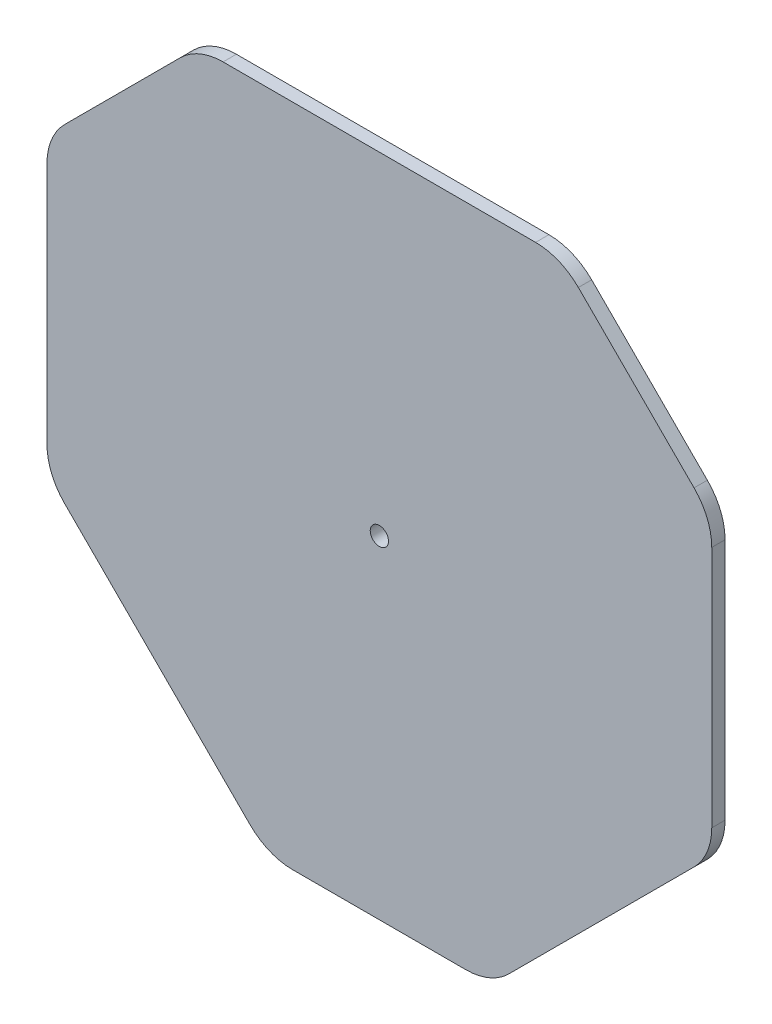
ISO-10303-21;
HEADER;
FILE_DESCRIPTION(('STEP AP214'),'2;1');
FILE_NAME('part.step','',(''),(''),'','','');
FILE_SCHEMA(('AUTOMOTIVE_DESIGN { 1 0 10303 214 1 1 1 1 }'));
ENDSEC;
DATA;
#1=APPLICATION_CONTEXT('core data for automotive mechanical design processes');
#2=APPLICATION_PROTOCOL_DEFINITION('international standard','automotive_design',2000,#1);
#3=PRODUCT_CONTEXT('',#1,'mechanical');
#4=PRODUCT('Part','Part','',(#3));
#5=PRODUCT_RELATED_PRODUCT_CATEGORY('part','',(#4));
#6=PRODUCT_DEFINITION_FORMATION('','',#4);
#7=PRODUCT_DEFINITION_CONTEXT('part definition',#1,'design');
#8=PRODUCT_DEFINITION('design','',#6,#7);
#9=PRODUCT_DEFINITION_SHAPE('','',#8);
#10=(LENGTH_UNIT() NAMED_UNIT(*) SI_UNIT(.MILLI.,.METRE.));
#11=(NAMED_UNIT(*) PLANE_ANGLE_UNIT() SI_UNIT($,.RADIAN.));
#12=(NAMED_UNIT(*) SI_UNIT($,.STERADIAN.) SOLID_ANGLE_UNIT());
#13=UNCERTAINTY_MEASURE_WITH_UNIT(LENGTH_MEASURE(1.E-05),#10,'distance_accuracy_value','');
#14=(GEOMETRIC_REPRESENTATION_CONTEXT(3) GLOBAL_UNCERTAINTY_ASSIGNED_CONTEXT((#13)) GLOBAL_UNIT_ASSIGNED_CONTEXT((#10,
#11,#12)) REPRESENTATION_CONTEXT('',''));
#15=CARTESIAN_POINT('',(0.,0.,0.));
#16=DIRECTION('',(0.,0.,1.));
#17=DIRECTION('',(1.,0.,0.));
#18=AXIS2_PLACEMENT_3D('',#15,#16,#17);
#19=CARTESIAN_POINT('',(114.300000000001,-12.6866880061755,5.588));
#20=DIRECTION('',(0.,0.,-1.));
#21=DIRECTION('',(-1.,0.,0.));
#22=AXIS2_PLACEMENT_3D('',#19,#20,#21);
#23=PLANE('',#22);
#24=CARTESIAN_POINT('',(-1.11022302462516E-13,-78.3656635218969,5.58799999999997));
#25=DIRECTION('',(0.,0.,1.));
#26=DIRECTION('',(0.999548269383224,0.030054237188835,0.));
#27=AXIS2_PLACEMENT_3D('',#24,#25,#26);
#28=CIRCLE('',#27,3.834765);
#29=CARTESIAN_POINT('',(3.83303271924125,-78.2504125850235,5.58799999999996));
#30=VERTEX_POINT('',#29);
#31=EDGE_CURVE('E317',#30,#30,#28,.F.);
#32=ORIENTED_EDGE('',*,*,#31,.T.);
#33=EDGE_LOOP('',(#32));
#34=FACE_BOUND('',#33,.T.);
#35=CARTESIAN_POINT('',(114.300000000001,-12.6866880061755,5.588));
#36=DIRECTION('',(0.,0.,1.));
#37=DIRECTION('',(-1.,0.,0.));
#38=AXIS2_PLACEMENT_3D('',#35,#36,#37);
#39=CIRCLE('',#38,25.4);
#40=CARTESIAN_POINT('',(139.700000000001,-12.6866880061761,5.588));
#41=VERTEX_POINT('',#40);
#42=CARTESIAN_POINT('',(132.26051224214,5.27382423596266,5.588));
#43=VERTEX_POINT('',#42);
#44=EDGE_CURVE('E208',#41,#43,#39,.T.);
#45=ORIENTED_EDGE('',*,*,#44,.T.);
#46=DIRECTION('',(-0.707106781186548,0.707106781186547,0.));
#47=VECTOR('',#46,1.);
#48=CARTESIAN_POINT('',(132.26051224214,5.27382423596266,5.588));
#49=LINE('',#48,#47);
#50=CARTESIAN_POINT('',(83.6394877578623,53.89484872024,5.588));
#51=VERTEX_POINT('',#50);
#52=EDGE_CURVE('E118',#43,#51,#49,.T.);
#53=ORIENTED_EDGE('',*,*,#52,.T.);
#54=CARTESIAN_POINT('',(65.6789755157243,35.9343364781021,5.588));
#55=DIRECTION('',(0.,0.,1.));
#56=DIRECTION('',(1.,0.,0.));
#57=AXIS2_PLACEMENT_3D('',#54,#55,#56);
#58=CIRCLE('',#57,25.3999999999997);
#59=CARTESIAN_POINT('',(65.6789755157231,61.3343364781018,5.588));
#60=VERTEX_POINT('',#59);
#61=EDGE_CURVE('E248',#51,#60,#58,.T.);
#62=ORIENTED_EDGE('',*,*,#61,.T.);
#63=DIRECTION('',(-1.,0.,0.));
#64=VECTOR('',#63,1.);
#65=CARTESIAN_POINT('',(65.6789755157231,61.3343364781021,5.588));
#66=LINE('',#65,#64);
#67=CARTESIAN_POINT('',(-65.6789755157226,61.334336478102,5.588));
#68=VERTEX_POINT('',#67);
#69=EDGE_CURVE('E267',#60,#68,#66,.T.);
#70=ORIENTED_EDGE('',*,*,#69,.T.);
#71=CARTESIAN_POINT('',(-65.6789755157226,35.934336478102,5.588));
#72=DIRECTION('',(0.,0.,1.));
#73=DIRECTION('',(1.,0.,0.));
#74=AXIS2_PLACEMENT_3D('',#71,#72,#73);
#75=CIRCLE('',#74,25.4);
#76=CARTESIAN_POINT('',(-83.6394877578606,53.8948487202406,5.588));
#77=VERTEX_POINT('',#76);
#78=EDGE_CURVE('E264',#68,#77,#75,.T.);
#79=ORIENTED_EDGE('',*,*,#78,.T.);
#80=DIRECTION('',(-0.70710678118656,-0.707106781186535,0.));
#81=VECTOR('',#80,1.);
#82=CARTESIAN_POINT('',(-83.6394877578606,53.8948487202406,5.588));
#83=LINE('',#82,#81);
#84=CARTESIAN_POINT('',(-132.260512242139,5.27382423596377,5.588));
#85=VERTEX_POINT('',#84);
#86=EDGE_CURVE('E266',#77,#85,#83,.T.);
#87=ORIENTED_EDGE('',*,*,#86,.T.);
#88=CARTESIAN_POINT('',(-114.300000000001,-12.6866880061749,5.588));
#89=DIRECTION('',(0.,0.,1.));
#90=DIRECTION('',(-1.,0.,0.));
#91=AXIS2_PLACEMENT_3D('',#88,#89,#90);
#92=CIRCLE('',#91,25.4);
#93=CARTESIAN_POINT('',(-139.700000000001,-12.6866880061747,5.588));
#94=VERTEX_POINT('',#93);
#95=EDGE_CURVE('E269',#85,#94,#92,.T.);
#96=ORIENTED_EDGE('',*,*,#95,.T.);
#97=DIRECTION('',(0.,-1.,0.));
#98=VECTOR('',#97,1.);
#99=CARTESIAN_POINT('',(-139.700000000001,-12.6866880061747,5.588));
#100=LINE('',#99,#98);
#101=CARTESIAN_POINT('',(-139.699999999999,-114.753454113722,5.588));
#102=VERTEX_POINT('',#101);
#103=EDGE_CURVE('E275',#94,#102,#100,.T.);
#104=ORIENTED_EDGE('',*,*,#103,.T.);
#105=CARTESIAN_POINT('',(-114.299999999999,-114.753454113721,5.588));
#106=DIRECTION('',(0.,0.,1.));
#107=DIRECTION('',(-1.,0.,0.));
#108=AXIS2_PLACEMENT_3D('',#105,#106,#107);
#109=CIRCLE('',#108,25.4);
#110=CARTESIAN_POINT('',(-132.260512242138,-132.71396635586,5.588));
#111=VERTEX_POINT('',#110);
#112=EDGE_CURVE('E277',#102,#111,#109,.T.);
#113=ORIENTED_EDGE('',*,*,#112,.T.);
#114=DIRECTION('',(0.707106781186553,-0.707106781186542,0.));
#115=VECTOR('',#114,1.);
#116=CARTESIAN_POINT('',(-132.260512242138,-132.71396635586,5.588));
#117=LINE('',#116,#115);
#118=CARTESIAN_POINT('',(-54.3483028339619,-210.626175764034,5.588));
#119=VERTEX_POINT('',#118);
#120=EDGE_CURVE('E279',#111,#119,#117,.T.);
#121=ORIENTED_EDGE('',*,*,#120,.T.);
#122=CARTESIAN_POINT('',(-36.3877905918237,-192.665663521896,5.588));
#123=DIRECTION('',(0.,0.,1.));
#124=DIRECTION('',(1.,0.,0.));
#125=AXIS2_PLACEMENT_3D('',#122,#123,#124);
#126=CIRCLE('',#125,25.4);
#127=CARTESIAN_POINT('',(-36.3877905918235,-218.065663521896,5.588));
#128=VERTEX_POINT('',#127);
#129=EDGE_CURVE('E281',#119,#128,#126,.T.);
#130=ORIENTED_EDGE('',*,*,#129,.T.);
#131=DIRECTION('',(1.,0.,0.));
#132=VECTOR('',#131,1.);
#133=CARTESIAN_POINT('',(-36.3877905918235,-218.065663521896,5.588));
#134=LINE('',#133,#132);
#135=CARTESIAN_POINT('',(36.3877905918245,-218.065663521896,5.588));
#136=VERTEX_POINT('',#135);
#137=EDGE_CURVE('E283',#128,#136,#134,.T.);
#138=ORIENTED_EDGE('',*,*,#137,.T.);
#139=CARTESIAN_POINT('',(36.3877905918256,-192.665663521895,5.588));
#140=DIRECTION('',(0.,0.,1.));
#141=DIRECTION('',(1.,0.,0.));
#142=AXIS2_PLACEMENT_3D('',#139,#140,#141);
#143=CIRCLE('',#142,25.4000000000002);
#144=CARTESIAN_POINT('',(54.3483028339643,-210.626175764033,5.588));
#145=VERTEX_POINT('',#144);
#146=EDGE_CURVE('E160',#136,#145,#143,.T.);
#147=ORIENTED_EDGE('',*,*,#146,.T.);
#148=DIRECTION('',(0.707106781186541,0.707106781186554,0.));
#149=VECTOR('',#148,1.);
#150=CARTESIAN_POINT('',(54.3483028339641,-210.626175764033,5.588));
#151=LINE('',#150,#149);
#152=CARTESIAN_POINT('',(132.260512242138,-132.713966355858,5.588));
#153=VERTEX_POINT('',#152);
#154=EDGE_CURVE('E155',#145,#153,#151,.T.);
#155=ORIENTED_EDGE('',*,*,#154,.T.);
#156=CARTESIAN_POINT('',(114.299999999999,-114.75345411372,5.588));
#157=DIRECTION('',(0.,0.,1.));
#158=DIRECTION('',(1.,0.,0.));
#159=AXIS2_PLACEMENT_3D('',#156,#157,#158);
#160=CIRCLE('',#159,25.4);
#161=CARTESIAN_POINT('',(139.699999999999,-114.753454113719,5.588));
#162=VERTEX_POINT('',#161);
#163=EDGE_CURVE('E158',#153,#162,#160,.T.);
#164=ORIENTED_EDGE('',*,*,#163,.T.);
#165=DIRECTION('',(0.,1.,0.));
#166=VECTOR('',#165,1.);
#167=CARTESIAN_POINT('',(139.699999999999,-114.753454113719,5.588));
#168=LINE('',#167,#166);
#169=EDGE_CURVE('E51',#162,#41,#168,.T.);
#170=ORIENTED_EDGE('',*,*,#169,.T.);
#171=EDGE_LOOP('',(#45,#53,#62,#70,#79,#87,#96,#104,#113,#121,#130,#138,#147,#155,#164,#170));
#172=FACE_BOUND('',#171,.T.);
#173=ADVANCED_FACE('F33',(#34,#172),#23,.F.);
#174=CARTESIAN_POINT('',(114.300000000001,-12.6866880061755,0.));
#175=DIRECTION('',(0.,0.,-1.));
#176=DIRECTION('',(-1.,0.,0.));
#177=AXIS2_PLACEMENT_3D('',#174,#175,#176);
#178=PLANE('',#177);
#179=CARTESIAN_POINT('',(114.300000000001,-12.6866880061755,0.));
#180=DIRECTION('',(0.,0.,1.));
#181=DIRECTION('',(-1.,0.,0.));
#182=AXIS2_PLACEMENT_3D('',#179,#180,#181);
#183=CIRCLE('',#182,25.4);
#184=CARTESIAN_POINT('',(139.700000000001,-12.6866880061761,0.));
#185=VERTEX_POINT('',#184);
#186=CARTESIAN_POINT('',(132.26051224214,5.27382423596266,0.));
#187=VERTEX_POINT('',#186);
#188=EDGE_CURVE('E178',#185,#187,#183,.T.);
#189=ORIENTED_EDGE('',*,*,#188,.F.);
#190=DIRECTION('',(0.,1.,0.));
#191=VECTOR('',#190,1.);
#192=CARTESIAN_POINT('',(139.699999999999,-114.753454113719,0.));
#193=LINE('',#192,#191);
#194=CARTESIAN_POINT('',(139.699999999999,-114.753454113719,0.));
#195=VERTEX_POINT('',#194);
#196=EDGE_CURVE('E110',#195,#185,#193,.T.);
#197=ORIENTED_EDGE('',*,*,#196,.F.);
#198=CARTESIAN_POINT('',(114.299999999999,-114.75345411372,0.));
#199=DIRECTION('',(0.,0.,1.));
#200=DIRECTION('',(1.,0.,0.));
#201=AXIS2_PLACEMENT_3D('',#198,#199,#200);
#202=CIRCLE('',#201,25.4);
#203=CARTESIAN_POINT('',(132.260512242138,-132.713966355858,0.));
#204=VERTEX_POINT('',#203);
#205=EDGE_CURVE('E104',#204,#195,#202,.T.);
#206=ORIENTED_EDGE('',*,*,#205,.F.);
#207=DIRECTION('',(0.707106781186541,0.707106781186554,0.));
#208=VECTOR('',#207,1.);
#209=CARTESIAN_POINT('',(54.3483028339641,-210.626175764033,0.));
#210=LINE('',#209,#208);
#211=CARTESIAN_POINT('',(54.3483028339643,-210.626175764033,0.));
#212=VERTEX_POINT('',#211);
#213=EDGE_CURVE('E168',#212,#204,#210,.T.);
#214=ORIENTED_EDGE('',*,*,#213,.F.);
#215=CARTESIAN_POINT('',(36.3877905918256,-192.665663521895,0.));
#216=DIRECTION('',(0.,0.,1.));
#217=DIRECTION('',(1.,0.,0.));
#218=AXIS2_PLACEMENT_3D('',#215,#216,#217);
#219=CIRCLE('',#218,25.4000000000002);
#220=CARTESIAN_POINT('',(36.3877905918245,-218.065663521896,0.));
#221=VERTEX_POINT('',#220);
#222=EDGE_CURVE('E203',#221,#212,#219,.T.);
#223=ORIENTED_EDGE('',*,*,#222,.F.);
#224=DIRECTION('',(1.,0.,0.));
#225=VECTOR('',#224,1.);
#226=CARTESIAN_POINT('',(-36.3877905918235,-218.065663521896,0.));
#227=LINE('',#226,#225);
#228=CARTESIAN_POINT('',(-36.3877905918235,-218.065663521896,0.));
#229=VERTEX_POINT('',#228);
#230=EDGE_CURVE('E201',#229,#221,#227,.T.);
#231=ORIENTED_EDGE('',*,*,#230,.F.);
#232=CARTESIAN_POINT('',(-36.3877905918237,-192.665663521896,0.));
#233=DIRECTION('',(0.,0.,1.));
#234=DIRECTION('',(1.,0.,0.));
#235=AXIS2_PLACEMENT_3D('',#232,#233,#234);
#236=CIRCLE('',#235,25.4);
#237=CARTESIAN_POINT('',(-54.3483028339619,-210.626175764034,0.));
#238=VERTEX_POINT('',#237);
#239=EDGE_CURVE('E199',#238,#229,#236,.T.);
#240=ORIENTED_EDGE('',*,*,#239,.F.);
#241=DIRECTION('',(0.707106781186553,-0.707106781186542,0.));
#242=VECTOR('',#241,1.);
#243=CARTESIAN_POINT('',(-132.260512242138,-132.71396635586,0.));
#244=LINE('',#243,#242);
#245=CARTESIAN_POINT('',(-132.260512242138,-132.71396635586,0.));
#246=VERTEX_POINT('',#245);
#247=EDGE_CURVE('E197',#246,#238,#244,.T.);
#248=ORIENTED_EDGE('',*,*,#247,.F.);
#249=CARTESIAN_POINT('',(-114.299999999999,-114.753454113721,0.));
#250=DIRECTION('',(0.,0.,1.));
#251=DIRECTION('',(-1.,0.,0.));
#252=AXIS2_PLACEMENT_3D('',#249,#250,#251);
#253=CIRCLE('',#252,25.4);
#254=CARTESIAN_POINT('',(-139.699999999999,-114.753454113722,0.));
#255=VERTEX_POINT('',#254);
#256=EDGE_CURVE('E195',#255,#246,#253,.T.);
#257=ORIENTED_EDGE('',*,*,#256,.F.);
#258=DIRECTION('',(0.,-1.,0.));
#259=VECTOR('',#258,1.);
#260=CARTESIAN_POINT('',(-139.700000000001,-12.6866880061747,0.));
#261=LINE('',#260,#259);
#262=CARTESIAN_POINT('',(-139.700000000001,-12.6866880061747,0.));
#263=VERTEX_POINT('',#262);
#264=EDGE_CURVE('E193',#263,#255,#261,.T.);
#265=ORIENTED_EDGE('',*,*,#264,.F.);
#266=CARTESIAN_POINT('',(-114.300000000001,-12.6866880061749,0.));
#267=DIRECTION('',(0.,0.,1.));
#268=DIRECTION('',(-1.,0.,0.));
#269=AXIS2_PLACEMENT_3D('',#266,#267,#268);
#270=CIRCLE('',#269,25.4);
#271=CARTESIAN_POINT('',(-132.260512242139,5.27382423596377,0.));
#272=VERTEX_POINT('',#271);
#273=EDGE_CURVE('E191',#272,#263,#270,.T.);
#274=ORIENTED_EDGE('',*,*,#273,.F.);
#275=DIRECTION('',(-0.70710678118656,-0.707106781186535,0.));
#276=VECTOR('',#275,1.);
#277=CARTESIAN_POINT('',(-83.6394877578606,53.8948487202406,0.));
#278=LINE('',#277,#276);
#279=CARTESIAN_POINT('',(-83.6394877578606,53.8948487202406,0.));
#280=VERTEX_POINT('',#279);
#281=EDGE_CURVE('E189',#280,#272,#278,.T.);
#282=ORIENTED_EDGE('',*,*,#281,.F.);
#283=CARTESIAN_POINT('',(-65.6789755157226,35.934336478102,0.));
#284=DIRECTION('',(0.,0.,1.));
#285=DIRECTION('',(1.,0.,0.));
#286=AXIS2_PLACEMENT_3D('',#283,#284,#285);
#287=CIRCLE('',#286,25.4);
#288=CARTESIAN_POINT('',(-65.6789755157226,61.334336478102,0.));
#289=VERTEX_POINT('',#288);
#290=EDGE_CURVE('E187',#289,#280,#287,.T.);
#291=ORIENTED_EDGE('',*,*,#290,.F.);
#292=DIRECTION('',(-1.,0.,0.));
#293=VECTOR('',#292,1.);
#294=CARTESIAN_POINT('',(65.6789755157231,61.3343364781021,0.));
#295=LINE('',#294,#293);
#296=CARTESIAN_POINT('',(65.6789755157231,61.3343364781018,0.));
#297=VERTEX_POINT('',#296);
#298=EDGE_CURVE('E185',#297,#289,#295,.T.);
#299=ORIENTED_EDGE('',*,*,#298,.F.);
#300=CARTESIAN_POINT('',(65.6789755157243,35.9343364781021,0.));
#301=DIRECTION('',(0.,0.,1.));
#302=DIRECTION('',(1.,0.,0.));
#303=AXIS2_PLACEMENT_3D('',#300,#301,#302);
#304=CIRCLE('',#303,25.3999999999997);
#305=CARTESIAN_POINT('',(83.6394877578623,53.89484872024,0.));
#306=VERTEX_POINT('',#305);
#307=EDGE_CURVE('E183',#306,#297,#304,.T.);
#308=ORIENTED_EDGE('',*,*,#307,.F.);
#309=DIRECTION('',(-0.707106781186548,0.707106781186547,0.));
#310=VECTOR('',#309,1.);
#311=CARTESIAN_POINT('',(132.26051224214,5.27382423596266,0.));
#312=LINE('',#311,#310);
#313=EDGE_CURVE('E181',#187,#306,#312,.T.);
#314=ORIENTED_EDGE('',*,*,#313,.F.);
#315=EDGE_LOOP('',(#189,#197,#206,#214,#223,#231,#240,#248,#257,#265,#274,#282,#291,#299,#308,#314));
#316=FACE_BOUND('',#315,.T.);
#317=CARTESIAN_POINT('',(-1.15851114936814E-13,-78.3656635218969,0.));
#318=DIRECTION('',(0.,0.,-1.));
#319=DIRECTION('',(-1.,0.,0.));
#320=AXIS2_PLACEMENT_3D('',#317,#318,#319);
#321=CIRCLE('',#320,3.834765);
#322=CARTESIAN_POINT('',(-3.83476500000012,-78.3656635218969,0.));
#323=VERTEX_POINT('',#322);
#324=EDGE_CURVE('E37',#323,#323,#321,.F.);
#325=ORIENTED_EDGE('',*,*,#324,.T.);
#326=EDGE_LOOP('',(#325));
#327=FACE_BOUND('',#326,.T.);
#328=ADVANCED_FACE('F252',(#316,#327),#178,.T.);
#329=CARTESIAN_POINT('',(114.300000000001,-12.6866880061755,5.588));
#330=DIRECTION('',(0.,0.,-1.));
#331=DIRECTION('',(-1.,0.,0.));
#332=AXIS2_PLACEMENT_3D('',#329,#330,#331);
#333=CYLINDRICAL_SURFACE('',#332,25.4);
#334=ORIENTED_EDGE('',*,*,#188,.T.);
#335=DIRECTION('',(0.,0.,-1.));
#336=VECTOR('',#335,1.);
#337=CARTESIAN_POINT('',(132.26051224214,5.27382423596266,5.588));
#338=LINE('',#337,#336);
#339=EDGE_CURVE('E11',#43,#187,#338,.T.);
#340=ORIENTED_EDGE('',*,*,#339,.F.);
#341=ORIENTED_EDGE('',*,*,#44,.F.);
#342=DIRECTION('',(0.,0.,-1.));
#343=VECTOR('',#342,1.);
#344=CARTESIAN_POINT('',(139.700000000001,-12.6866880061761,5.588));
#345=LINE('',#344,#343);
#346=EDGE_CURVE('E174',#41,#185,#345,.T.);
#347=ORIENTED_EDGE('',*,*,#346,.T.);
#348=EDGE_LOOP('',(#334,#340,#341,#347));
#349=FACE_BOUND('',#348,.T.);
#350=ADVANCED_FACE('F35',(#349),#333,.T.);
#351=CARTESIAN_POINT('',(132.26051224214,5.27382423596266,5.588));
#352=DIRECTION('',(-0.707106781186547,-0.707106781186548,0.));
#353=DIRECTION('',(0.707106781186548,-0.707106781186547,0.));
#354=AXIS2_PLACEMENT_3D('',#351,#352,#353);
#355=PLANE('',#354);
#356=ORIENTED_EDGE('',*,*,#313,.T.);
#357=DIRECTION('',(0.,0.,-1.));
#358=VECTOR('',#357,1.);
#359=CARTESIAN_POINT('',(83.6394877578623,53.89484872024,5.588));
#360=LINE('',#359,#358);
#361=EDGE_CURVE('E43',#51,#306,#360,.T.);
#362=ORIENTED_EDGE('',*,*,#361,.F.);
#363=ORIENTED_EDGE('',*,*,#52,.F.);
#364=ORIENTED_EDGE('',*,*,#339,.T.);
#365=EDGE_LOOP('',(#356,#362,#363,#364));
#366=FACE_BOUND('',#365,.T.);
#367=ADVANCED_FACE('F327',(#366),#355,.F.);
#368=CARTESIAN_POINT('',(65.6789755157243,35.9343364781021,5.588));
#369=DIRECTION('',(0.,0.,-1.));
#370=DIRECTION('',(-1.,0.,0.));
#371=AXIS2_PLACEMENT_3D('',#368,#369,#370);
#372=CYLINDRICAL_SURFACE('',#371,25.3999999999997);
#373=ORIENTED_EDGE('',*,*,#307,.T.);
#374=DIRECTION('',(0.,0.,-1.));
#375=VECTOR('',#374,1.);
#376=CARTESIAN_POINT('',(65.6789755157231,61.3343364781018,5.588));
#377=LINE('',#376,#375);
#378=EDGE_CURVE('E239',#60,#297,#377,.T.);
#379=ORIENTED_EDGE('',*,*,#378,.F.);
#380=ORIENTED_EDGE('',*,*,#61,.F.);
#381=ORIENTED_EDGE('',*,*,#361,.T.);
#382=EDGE_LOOP('',(#373,#379,#380,#381));
#383=FACE_BOUND('',#382,.T.);
#384=ADVANCED_FACE('F246',(#383),#372,.T.);
#385=CARTESIAN_POINT('',(65.6789755157231,61.3343364781021,5.588));
#386=DIRECTION('',(0.,-1.,0.));
#387=DIRECTION('',(1.,0.,0.));
#388=AXIS2_PLACEMENT_3D('',#385,#386,#387);
#389=PLANE('',#388);
#390=ORIENTED_EDGE('',*,*,#298,.T.);
#391=DIRECTION('',(0.,0.,-1.));
#392=VECTOR('',#391,1.);
#393=CARTESIAN_POINT('',(-65.6789755157226,61.334336478102,5.588));
#394=LINE('',#393,#392);
#395=EDGE_CURVE('E236',#68,#289,#394,.T.);
#396=ORIENTED_EDGE('',*,*,#395,.F.);
#397=ORIENTED_EDGE('',*,*,#69,.F.);
#398=ORIENTED_EDGE('',*,*,#378,.T.);
#399=EDGE_LOOP('',(#390,#396,#397,#398));
#400=FACE_BOUND('',#399,.T.);
#401=ADVANCED_FACE('F258',(#400),#389,.F.);
#402=CARTESIAN_POINT('',(-65.6789755157226,35.934336478102,5.588));
#403=DIRECTION('',(0.,0.,-1.));
#404=DIRECTION('',(-1.,0.,0.));
#405=AXIS2_PLACEMENT_3D('',#402,#403,#404);
#406=CYLINDRICAL_SURFACE('',#405,25.4);
#407=ORIENTED_EDGE('',*,*,#290,.T.);
#408=DIRECTION('',(0.,0.,-1.));
#409=VECTOR('',#408,1.);
#410=CARTESIAN_POINT('',(-83.6394877578606,53.8948487202406,5.588));
#411=LINE('',#410,#409);
#412=EDGE_CURVE('E233',#77,#280,#411,.T.);
#413=ORIENTED_EDGE('',*,*,#412,.F.);
#414=ORIENTED_EDGE('',*,*,#78,.F.);
#415=ORIENTED_EDGE('',*,*,#395,.T.);
#416=EDGE_LOOP('',(#407,#413,#414,#415));
#417=FACE_BOUND('',#416,.T.);
#418=ADVANCED_FACE('F262',(#417),#406,.T.);
#419=CARTESIAN_POINT('',(-83.6394877578606,53.8948487202406,5.588));
#420=DIRECTION('',(0.707106781186535,-0.70710678118656,0.));
#421=DIRECTION('',(0.70710678118656,0.707106781186535,0.));
#422=AXIS2_PLACEMENT_3D('',#419,#420,#421);
#423=PLANE('',#422);
#424=ORIENTED_EDGE('',*,*,#281,.T.);
#425=DIRECTION('',(0.,0.,-1.));
#426=VECTOR('',#425,1.);
#427=CARTESIAN_POINT('',(-132.260512242139,5.27382423596377,5.588));
#428=LINE('',#427,#426);
#429=EDGE_CURVE('E230',#85,#272,#428,.T.);
#430=ORIENTED_EDGE('',*,*,#429,.F.);
#431=ORIENTED_EDGE('',*,*,#86,.F.);
#432=ORIENTED_EDGE('',*,*,#412,.T.);
#433=EDGE_LOOP('',(#424,#430,#431,#432));
#434=FACE_BOUND('',#433,.T.);
#435=ADVANCED_FACE('F340',(#434),#423,.F.);
#436=CARTESIAN_POINT('',(-114.300000000001,-12.6866880061749,5.588));
#437=DIRECTION('',(0.,0.,-1.));
#438=DIRECTION('',(-1.,0.,0.));
#439=AXIS2_PLACEMENT_3D('',#436,#437,#438);
#440=CYLINDRICAL_SURFACE('',#439,25.4);
#441=ORIENTED_EDGE('',*,*,#273,.T.);
#442=DIRECTION('',(0.,0.,-1.));
#443=VECTOR('',#442,1.);
#444=CARTESIAN_POINT('',(-139.700000000001,-12.6866880061747,5.588));
#445=LINE('',#444,#443);
#446=EDGE_CURVE('E227',#94,#263,#445,.T.);
#447=ORIENTED_EDGE('',*,*,#446,.F.);
#448=ORIENTED_EDGE('',*,*,#95,.F.);
#449=ORIENTED_EDGE('',*,*,#429,.T.);
#450=EDGE_LOOP('',(#441,#447,#448,#449));
#451=FACE_BOUND('',#450,.T.);
#452=ADVANCED_FACE('F343',(#451),#440,.T.);
#453=CARTESIAN_POINT('',(-139.700000000001,-12.6866880061747,5.588));
#454=DIRECTION('',(1.,0.,0.));
#455=DIRECTION('',(0.,1.,0.));
#456=AXIS2_PLACEMENT_3D('',#453,#454,#455);
#457=PLANE('',#456);
#458=ORIENTED_EDGE('',*,*,#264,.T.);
#459=DIRECTION('',(0.,0.,-1.));
#460=VECTOR('',#459,1.);
#461=CARTESIAN_POINT('',(-139.699999999999,-114.753454113722,5.588));
#462=LINE('',#461,#460);
#463=EDGE_CURVE('E224',#102,#255,#462,.T.);
#464=ORIENTED_EDGE('',*,*,#463,.F.);
#465=ORIENTED_EDGE('',*,*,#103,.F.);
#466=ORIENTED_EDGE('',*,*,#446,.T.);
#467=EDGE_LOOP('',(#458,#464,#465,#466));
#468=FACE_BOUND('',#467,.T.);
#469=ADVANCED_FACE('F347',(#468),#457,.F.);
#470=CARTESIAN_POINT('',(-114.299999999999,-114.753454113721,5.588));
#471=DIRECTION('',(0.,0.,-1.));
#472=DIRECTION('',(-1.,0.,0.));
#473=AXIS2_PLACEMENT_3D('',#470,#471,#472);
#474=CYLINDRICAL_SURFACE('',#473,25.4);
#475=ORIENTED_EDGE('',*,*,#256,.T.);
#476=DIRECTION('',(0.,0.,-1.));
#477=VECTOR('',#476,1.);
#478=CARTESIAN_POINT('',(-132.260512242138,-132.71396635586,5.588));
#479=LINE('',#478,#477);
#480=EDGE_CURVE('E221',#111,#246,#479,.T.);
#481=ORIENTED_EDGE('',*,*,#480,.F.);
#482=ORIENTED_EDGE('',*,*,#112,.F.);
#483=ORIENTED_EDGE('',*,*,#463,.T.);
#484=EDGE_LOOP('',(#475,#481,#482,#483));
#485=FACE_BOUND('',#484,.T.);
#486=ADVANCED_FACE('F351',(#485),#474,.T.);
#487=CARTESIAN_POINT('',(-132.260512242138,-132.71396635586,5.588));
#488=DIRECTION('',(0.707106781186542,0.707106781186553,0.));
#489=DIRECTION('',(-0.707106781186553,0.707106781186542,0.));
#490=AXIS2_PLACEMENT_3D('',#487,#488,#489);
#491=PLANE('',#490);
#492=ORIENTED_EDGE('',*,*,#247,.T.);
#493=DIRECTION('',(0.,0.,-1.));
#494=VECTOR('',#493,1.);
#495=CARTESIAN_POINT('',(-54.3483028339619,-210.626175764034,5.588));
#496=LINE('',#495,#494);
#497=EDGE_CURVE('E218',#119,#238,#496,.T.);
#498=ORIENTED_EDGE('',*,*,#497,.F.);
#499=ORIENTED_EDGE('',*,*,#120,.F.);
#500=ORIENTED_EDGE('',*,*,#480,.T.);
#501=EDGE_LOOP('',(#492,#498,#499,#500));
#502=FACE_BOUND('',#501,.T.);
#503=ADVANCED_FACE('F355',(#502),#491,.F.);
#504=CARTESIAN_POINT('',(-36.3877905918237,-192.665663521896,5.588));
#505=DIRECTION('',(0.,0.,-1.));
#506=DIRECTION('',(-1.,0.,0.));
#507=AXIS2_PLACEMENT_3D('',#504,#505,#506);
#508=CYLINDRICAL_SURFACE('',#507,25.4);
#509=ORIENTED_EDGE('',*,*,#239,.T.);
#510=DIRECTION('',(0.,0.,-1.));
#511=VECTOR('',#510,1.);
#512=CARTESIAN_POINT('',(-36.3877905918235,-218.065663521896,5.588));
#513=LINE('',#512,#511);
#514=EDGE_CURVE('E215',#128,#229,#513,.T.);
#515=ORIENTED_EDGE('',*,*,#514,.F.);
#516=ORIENTED_EDGE('',*,*,#129,.F.);
#517=ORIENTED_EDGE('',*,*,#497,.T.);
#518=EDGE_LOOP('',(#509,#515,#516,#517));
#519=FACE_BOUND('',#518,.T.);
#520=ADVANCED_FACE('F359',(#519),#508,.T.);
#521=CARTESIAN_POINT('',(-36.3877905918235,-218.065663521896,5.588));
#522=DIRECTION('',(0.,1.,0.));
#523=DIRECTION('',(-1.,0.,0.));
#524=AXIS2_PLACEMENT_3D('',#521,#522,#523);
#525=PLANE('',#524);
#526=ORIENTED_EDGE('',*,*,#230,.T.);
#527=DIRECTION('',(0.,0.,-1.));
#528=VECTOR('',#527,1.);
#529=CARTESIAN_POINT('',(36.3877905918245,-218.065663521896,5.588));
#530=LINE('',#529,#528);
#531=EDGE_CURVE('E212',#136,#221,#530,.T.);
#532=ORIENTED_EDGE('',*,*,#531,.F.);
#533=ORIENTED_EDGE('',*,*,#137,.F.);
#534=ORIENTED_EDGE('',*,*,#514,.T.);
#535=EDGE_LOOP('',(#526,#532,#533,#534));
#536=FACE_BOUND('',#535,.T.);
#537=ADVANCED_FACE('F289',(#536),#525,.F.);
#538=CARTESIAN_POINT('',(36.3877905918256,-192.665663521895,5.588));
#539=DIRECTION('',(0.,0.,-1.));
#540=DIRECTION('',(-1.,0.,0.));
#541=AXIS2_PLACEMENT_3D('',#538,#539,#540);
#542=CYLINDRICAL_SURFACE('',#541,25.4000000000002);
#543=ORIENTED_EDGE('',*,*,#222,.T.);
#544=DIRECTION('',(0.,0.,-1.));
#545=VECTOR('',#544,1.);
#546=CARTESIAN_POINT('',(54.3483028339643,-210.626175764033,5.588));
#547=LINE('',#546,#545);
#548=EDGE_CURVE('E169',#145,#212,#547,.T.);
#549=ORIENTED_EDGE('',*,*,#548,.F.);
#550=ORIENTED_EDGE('',*,*,#146,.F.);
#551=ORIENTED_EDGE('',*,*,#531,.T.);
#552=EDGE_LOOP('',(#543,#549,#550,#551));
#553=FACE_BOUND('',#552,.T.);
#554=ADVANCED_FACE('F293',(#553),#542,.T.);
#555=CARTESIAN_POINT('',(54.3483028339641,-210.626175764033,5.588));
#556=DIRECTION('',(-0.707106781186554,0.707106781186541,0.));
#557=DIRECTION('',(-0.707106781186541,-0.707106781186554,0.));
#558=AXIS2_PLACEMENT_3D('',#555,#556,#557);
#559=PLANE('',#558);
#560=ORIENTED_EDGE('',*,*,#213,.T.);
#561=DIRECTION('',(0.,0.,-1.));
#562=VECTOR('',#561,1.);
#563=CARTESIAN_POINT('',(132.260512242138,-132.713966355858,5.588));
#564=LINE('',#563,#562);
#565=EDGE_CURVE('E165',#153,#204,#564,.T.);
#566=ORIENTED_EDGE('',*,*,#565,.F.);
#567=ORIENTED_EDGE('',*,*,#154,.F.);
#568=ORIENTED_EDGE('',*,*,#548,.T.);
#569=EDGE_LOOP('',(#560,#566,#567,#568));
#570=FACE_BOUND('',#569,.T.);
#571=ADVANCED_FACE('F166',(#570),#559,.F.);
#572=CARTESIAN_POINT('',(114.299999999999,-114.75345411372,5.588));
#573=DIRECTION('',(0.,0.,-1.));
#574=DIRECTION('',(-1.,0.,0.));
#575=AXIS2_PLACEMENT_3D('',#572,#573,#574);
#576=CYLINDRICAL_SURFACE('',#575,25.4);
#577=ORIENTED_EDGE('',*,*,#205,.T.);
#578=DIRECTION('',(0.,0.,-1.));
#579=VECTOR('',#578,1.);
#580=CARTESIAN_POINT('',(139.699999999999,-114.753454113719,5.588));
#581=LINE('',#580,#579);
#582=EDGE_CURVE('E170',#162,#195,#581,.T.);
#583=ORIENTED_EDGE('',*,*,#582,.F.);
#584=ORIENTED_EDGE('',*,*,#163,.F.);
#585=ORIENTED_EDGE('',*,*,#565,.T.);
#586=EDGE_LOOP('',(#577,#583,#584,#585));
#587=FACE_BOUND('',#586,.T.);
#588=ADVANCED_FACE('F172',(#587),#576,.T.);
#589=CARTESIAN_POINT('',(139.699999999999,-114.753454113719,5.588));
#590=DIRECTION('',(-1.,0.,0.));
#591=DIRECTION('',(0.,-1.,0.));
#592=AXIS2_PLACEMENT_3D('',#589,#590,#591);
#593=PLANE('',#592);
#594=ORIENTED_EDGE('',*,*,#196,.T.);
#595=ORIENTED_EDGE('',*,*,#346,.F.);
#596=ORIENTED_EDGE('',*,*,#169,.F.);
#597=ORIENTED_EDGE('',*,*,#582,.T.);
#598=EDGE_LOOP('',(#594,#595,#596,#597));
#599=FACE_BOUND('',#598,.T.);
#600=ADVANCED_FACE('F297',(#599),#593,.F.);
#601=CARTESIAN_POINT('',(-1.18627682109536E-13,-78.3656635218969,-3.21310000000003));
#602=DIRECTION('',(0.,0.,1.));
#603=DIRECTION('',(0.999548269383224,0.030054237188835,0.));
#604=AXIS2_PLACEMENT_3D('',#601,#602,#603);
#605=CYLINDRICAL_SURFACE('',#604,3.834765);
#606=ORIENTED_EDGE('',*,*,#324,.F.);
#607=EDGE_LOOP('',(#606));
#608=FACE_BOUND('',#607,.T.);
#609=ORIENTED_EDGE('',*,*,#31,.F.);
#610=EDGE_LOOP('',(#609));
#611=FACE_BOUND('',#610,.T.);
#612=ADVANCED_FACE('F299',(#608,#611),#605,.F.);
#613=CLOSED_SHELL('',(#173,#328,#350,#367,#384,#401,#418,#435,#452,#469,#486,#503,#520,#537,
#554,#571,#588,#600,#612));
#614=MANIFOLD_SOLID_BREP('B2',#613);
#615=ADVANCED_BREP_SHAPE_REPRESENTATION('',(#18,#614),#14);
#616=SHAPE_DEFINITION_REPRESENTATION(#9,#615);
ENDSEC;
END-ISO-10303-21;
